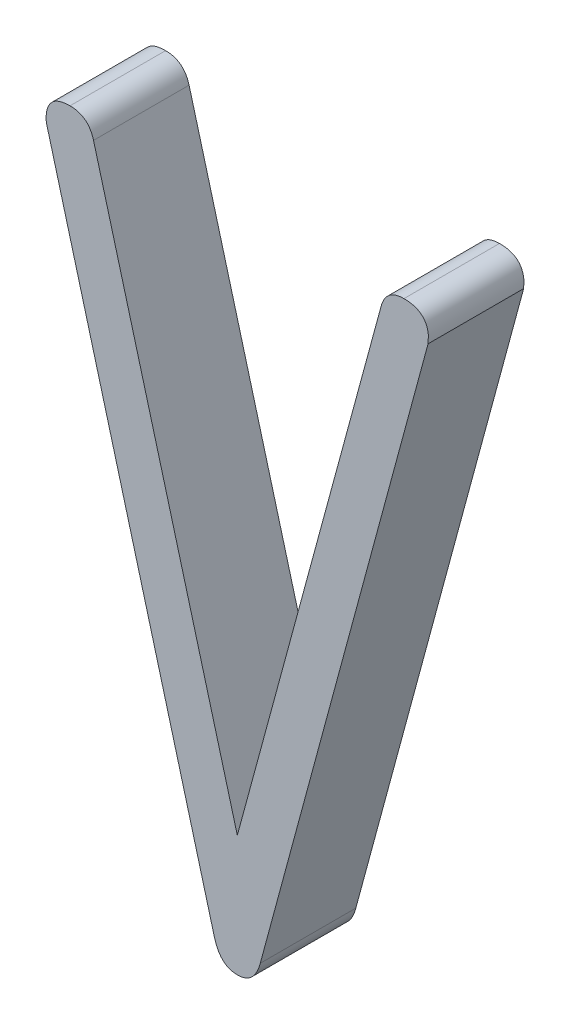
ISO-10303-21;
HEADER;
FILE_DESCRIPTION(('STEP AP214'),'2;1');
FILE_NAME('part.step','',(''),(''),'','','');
FILE_SCHEMA(('AUTOMOTIVE_DESIGN { 1 0 10303 214 1 1 1 1 }'));
ENDSEC;
DATA;
#1=APPLICATION_CONTEXT('core data for automotive mechanical design processes');
#2=APPLICATION_PROTOCOL_DEFINITION('international standard','automotive_design',2000,#1);
#3=PRODUCT_CONTEXT('',#1,'mechanical');
#4=PRODUCT('Part','Part','',(#3));
#5=PRODUCT_RELATED_PRODUCT_CATEGORY('part','',(#4));
#6=PRODUCT_DEFINITION_FORMATION('','',#4);
#7=PRODUCT_DEFINITION_CONTEXT('part definition',#1,'design');
#8=PRODUCT_DEFINITION('design','',#6,#7);
#9=PRODUCT_DEFINITION_SHAPE('','',#8);
#10=(LENGTH_UNIT() NAMED_UNIT(*) SI_UNIT(.MILLI.,.METRE.));
#11=(NAMED_UNIT(*) PLANE_ANGLE_UNIT() SI_UNIT($,.RADIAN.));
#12=(NAMED_UNIT(*) SI_UNIT($,.STERADIAN.) SOLID_ANGLE_UNIT());
#13=UNCERTAINTY_MEASURE_WITH_UNIT(LENGTH_MEASURE(1.E-05),#10,'distance_accuracy_value','');
#14=(GEOMETRIC_REPRESENTATION_CONTEXT(3) GLOBAL_UNCERTAINTY_ASSIGNED_CONTEXT((#13)) GLOBAL_UNIT_ASSIGNED_CONTEXT((#10,
#11,#12)) REPRESENTATION_CONTEXT('',''));
#15=CARTESIAN_POINT('',(0.,0.,0.));
#16=DIRECTION('',(0.,0.,1.));
#17=DIRECTION('',(1.,0.,0.));
#18=AXIS2_PLACEMENT_3D('',#15,#16,#17);
#19=CARTESIAN_POINT('',(0.,0.,0.));
#20=DIRECTION('',(0.,0.,1.));
#21=DIRECTION('',(1.,0.,0.));
#22=AXIS2_PLACEMENT_3D('',#19,#20,#21);
#23=PLANE('',#22);
#24=CARTESIAN_POINT('',(21.1206983712734,-3.7994522451301,0.));
#25=CARTESIAN_POINT('',(21.1185903138631,-3.79946194860089,0.));
#26=CARTESIAN_POINT('',(21.1164462873675,-3.79958557622458,0.));
#27=CARTESIAN_POINT('',(21.1121775705739,-3.80023827212831,0.));
#28=CARTESIAN_POINT('',(21.1100543955455,-3.80077638223874,0.));
#29=CARTESIAN_POINT('',(21.1061037758556,-3.80241864145331,0.));
#30=CARTESIAN_POINT('',(21.1042680794965,-3.803500139914,0.));
#31=CARTESIAN_POINT('',(21.1010989843482,-3.80626212531699,0.));
#32=CARTESIAN_POINT('',(21.0997675696505,-3.80794492867529,0.));
#33=CARTESIAN_POINT('',(21.0975044837042,-3.8120337579714,0.));
#34=CARTESIAN_POINT('',(21.0967231988323,-3.81451747322345,0.));
#35=CARTESIAN_POINT('',(21.0959264060027,-3.81882981526732,0.));
#36=CARTESIAN_POINT('',(21.095754409403,-3.82063923663918,0.));
#37=CARTESIAN_POINT('',(21.0956697633971,-3.82333918361365,0.));
#38=CARTESIAN_POINT('',(21.0956695533646,-3.82422738516833,0.));
#39=CARTESIAN_POINT('',(21.0956771840093,-3.82600262088804,0.));
#40=CARTESIAN_POINT('',(21.0956850137788,-3.82688965500423,0.));
#41=CARTESIAN_POINT('',(21.0956733712734,-3.8277759951301,0.));
#42=B_SPLINE_CURVE_WITH_KNOTS('',3,(#24,#25,#26,#27,#28,#29,#30,#31,#32,#33,#34,#35,#36,#37,#38,
#39,#40,#41),.UNSPECIFIED.,.F.,.F.,(4,2,2,2,2,2,2,2,4),(0.,0.00637906803394492,
0.0129013779902471,0.01917192918956,0.0254669016725837,0.0331339736282286,0.0385746638490084,
0.041238663694575,0.0438990540692007),.UNSPECIFIED.);
#43=CARTESIAN_POINT('',(21.1206983712734,-3.7994522451301,0.));
#44=VERTEX_POINT('',#43);
#45=CARTESIAN_POINT('',(21.0961721212734,-3.8277759951301,0.));
#46=VERTEX_POINT('',#45);
#47=EDGE_CURVE('E148',#44,#46,#42,.T.);
#48=ORIENTED_EDGE('',*,*,#47,.T.);
#49=DIRECTION('',(0.261841637735637,-0.96511085205168,0.));
#50=VECTOR('',#49,1.);
#51=CARTESIAN_POINT('',(21.0966708712734,-3.8315997451301,0.));
#52=LINE('',#51,#50);
#53=CARTESIAN_POINT('',(21.2717583712734,-4.4769472451301,0.));
#54=VERTEX_POINT('',#53);
#55=EDGE_CURVE('E97',#54,#46,#52,.F.);
#56=ORIENTED_EDGE('',*,*,#55,.F.);
#57=CARTESIAN_POINT('',(21.2717583712734,-4.4769472451301,0.));
#58=CARTESIAN_POINT('',(21.2728127435023,-4.48101979600794,0.));
#59=CARTESIAN_POINT('',(21.2744239974176,-4.48531183747608,0.));
#60=CARTESIAN_POINT('',(21.2781859148117,-4.49115196557534,0.));
#61=CARTESIAN_POINT('',(21.2798121972382,-4.49308902499719,0.));
#62=CARTESIAN_POINT('',(21.282708181856,-4.49549217070897,0.));
#63=CARTESIAN_POINT('',(21.2837556944478,-4.49621168334934,0.));
#64=CARTESIAN_POINT('',(21.285973462753,-4.4974384213446,0.));
#65=CARTESIAN_POINT('',(21.2871442355813,-4.4979447038555,0.));
#66=CARTESIAN_POINT('',(21.2895464952244,-4.4987289045473,0.));
#67=CARTESIAN_POINT('',(21.2907773577761,-4.49900879128011,0.));
#68=CARTESIAN_POINT('',(21.2932635049179,-4.49937118105636,0.));
#69=CARTESIAN_POINT('',(21.2945186710394,-4.49945447533704,0.));
#70=CARTESIAN_POINT('',(21.2957683712734,-4.4994522451301,0.));
#71=B_SPLINE_CURVE_WITH_KNOTS('',3,(#57,#58,#59,#60,#61,#62,#63,#64,#65,#66,#67,#68,#69,#70),
.UNSPECIFIED.,.F.,.F.,(4,2,2,2,2,2,4),(0.,0.0130937867306535,0.020594647858926,
0.0243812846568384,0.0281844934508452,0.0319542660278836,0.0357088401121007),.UNSPECIFIED.);
#72=CARTESIAN_POINT('',(21.2957683712734,-4.4994522451301,0.));
#73=VERTEX_POINT('',#72);
#74=EDGE_CURVE('E133',#54,#73,#71,.T.);
#75=ORIENTED_EDGE('',*,*,#74,.T.);
#76=CARTESIAN_POINT('',(21.2957683712734,-4.4994522451301,0.));
#77=CARTESIAN_POINT('',(21.2970420496136,-4.49945113890577,0.));
#78=CARTESIAN_POINT('',(21.2983199628194,-4.49936658822377,0.));
#79=CARTESIAN_POINT('',(21.3008487514697,-4.49899448172415,0.));
#80=CARTESIAN_POINT('',(21.3020995324221,-4.49870630671857,0.));
#81=CARTESIAN_POINT('',(21.3057512224966,-4.49748058853136,0.));
#82=CARTESIAN_POINT('',(21.3080452726058,-4.49618152429531,0.));
#83=CARTESIAN_POINT('',(21.3117377490816,-4.49305922230645,0.));
#84=CARTESIAN_POINT('',(21.31321101156,-4.49131855942591,0.));
#85=CARTESIAN_POINT('',(21.3167214670543,-4.48605988989829,0.));
#86=CARTESIAN_POINT('',(21.3182696065067,-4.48223252293233,0.));
#87=CARTESIAN_POINT('',(21.3195424490052,-4.47787486022175,0.));
#88=CARTESIAN_POINT('',(21.3196718068821,-4.47741121097638,0.));
#89=CARTESIAN_POINT('',(21.3197958712734,-4.4769472451301,0.));
#90=B_SPLINE_CURVE_WITH_KNOTS('',3,(#76,#77,#78,#79,#80,#81,#82,#83,#84,#85,#86,#87,#88,#89),
.UNSPECIFIED.,.F.,.F.,(4,2,2,2,2,2,4),(0.,0.00382370389001308,0.00765908535029806,
0.0153473873779117,0.0221042106874628,0.0342563446680747,0.0356999344152546),.UNSPECIFIED.);
#91=CARTESIAN_POINT('',(21.3197958712734,-4.4769472451301,0.));
#92=VERTEX_POINT('',#91);
#93=EDGE_CURVE('E24',#73,#92,#90,.T.);
#94=ORIENTED_EDGE('',*,*,#93,.T.);
#95=DIRECTION('',(0.261841637735637,0.96511085205168,0.));
#96=VECTOR('',#95,1.);
#97=CARTESIAN_POINT('',(21.3197958712734,-4.4769472451301,0.));
#98=LINE('',#97,#96);
#99=CARTESIAN_POINT('',(21.4953908712734,-3.8277759951301,0.));
#100=VERTEX_POINT('',#99);
#101=EDGE_CURVE('E165',#100,#92,#98,.F.);
#102=ORIENTED_EDGE('',*,*,#101,.F.);
#103=CARTESIAN_POINT('',(21.4958983712734,-3.8277759951301,0.));
#104=CARTESIAN_POINT('',(21.495887294004,-3.82677034094273,0.));
#105=CARTESIAN_POINT('',(21.495897423019,-3.82576388392917,0.));
#106=CARTESIAN_POINT('',(21.4958993231905,-3.82374724968531,0.));
#107=CARTESIAN_POINT('',(21.4958910232864,-3.82273707310141,0.));
#108=CARTESIAN_POINT('',(21.4957440683493,-3.81966605674523,0.));
#109=CARTESIAN_POINT('',(21.495478478193,-3.81760833005813,0.));
#110=CARTESIAN_POINT('',(21.4944487841622,-3.81340572762339,0.));
#111=CARTESIAN_POINT('',(21.4936422947943,-3.81126947018837,0.));
#112=CARTESIAN_POINT('',(21.4912919883958,-3.80739524900692,0.));
#113=CARTESIAN_POINT('',(21.489742637222,-3.80566042204234,0.));
#114=CARTESIAN_POINT('',(21.4863237266705,-3.80305342310958,0.));
#115=CARTESIAN_POINT('',(21.4845073762357,-3.80210790809743,0.));
#116=CARTESIAN_POINT('',(21.479443121936,-3.80021155263044,0.));
#117=CARTESIAN_POINT('',(21.4760519252917,-3.79968220013427,0.));
#118=CARTESIAN_POINT('',(21.4718263193732,-3.79947267071844,0.));
#119=CARTESIAN_POINT('',(21.4709800901237,-3.79945341193951,0.));
#120=CARTESIAN_POINT('',(21.4701383712734,-3.7994522451301,0.));
#121=B_SPLINE_CURVE_WITH_KNOTS('',3,(#103,#104,#105,#106,#107,#108,#109,#110,#111,#112,#113,
#114,#115,#116,#117,#118,#119,#120),.UNSPECIFIED.,.F.,.F.,(4,2,2,2,2,2,2,2,4),(0.,
0.00301848469965674,0.00604862868268714,0.012239313799241,0.0189826372191355,0.0257769963324192,
0.0318318197587784,0.0419463219560085,0.0444820605668184),.UNSPECIFIED.);
#122=CARTESIAN_POINT('',(21.4701383712734,-3.7994522451301,0.));
#123=VERTEX_POINT('',#122);
#124=EDGE_CURVE('E113',#100,#123,#121,.T.);
#125=ORIENTED_EDGE('',*,*,#124,.T.);
#126=CARTESIAN_POINT('',(21.4701383712734,-3.7994522451301,0.));
#127=CARTESIAN_POINT('',(21.4684627986756,-3.7994538497395,0.));
#128=CARTESIAN_POINT('',(21.4667737151767,-3.79956645553327,0.));
#129=CARTESIAN_POINT('',(21.4634288895068,-3.80009380005809,0.));
#130=CARTESIAN_POINT('',(21.4617736458116,-3.80051153165073,0.));
#131=CARTESIAN_POINT('',(21.4580414339516,-3.80194419133063,0.));
#132=CARTESIAN_POINT('',(21.4560174515428,-3.80311605552713,0.));
#133=CARTESIAN_POINT('',(21.4525179199704,-3.8060737486895,0.));
#134=CARTESIAN_POINT('',(21.4510421037115,-3.80785927782682,0.));
#135=CARTESIAN_POINT('',(21.4481656561408,-3.81247955525888,0.));
#136=CARTESIAN_POINT('',(21.4469830479753,-3.81546068200283,0.));
#137=CARTESIAN_POINT('',(21.4462333712734,-3.8184222451301,0.));
#138=B_SPLINE_CURVE_WITH_KNOTS('',3,(#126,#127,#128,#129,#130,#131,#132,#133,#134,#135,#136,
#137),.UNSPECIFIED.,.F.,.F.,(4,2,2,2,2,4),(0.,0.00504287618513018,0.0101358917776409,
0.0169963092321349,0.0238533795314925,0.0331771308776703),.UNSPECIFIED.);
#139=CARTESIAN_POINT('',(21.4462333712734,-3.8184222451301,0.));
#140=VERTEX_POINT('',#139);
#141=EDGE_CURVE('E163',#123,#140,#138,.T.);
#142=ORIENTED_EDGE('',*,*,#141,.T.);
#143=DIRECTION('',(-0.261820959999834,-0.965116461834926,0.));
#144=VECTOR('',#143,1.);
#145=CARTESIAN_POINT('',(21.4462333712734,-3.8184222451301,0.));
#146=LINE('',#145,#144);
#147=CARTESIAN_POINT('',(21.2957858712734,-4.3729972451301,0.));
#148=VERTEX_POINT('',#147);
#149=EDGE_CURVE('E160',#148,#140,#146,.F.);
#150=ORIENTED_EDGE('',*,*,#149,.F.);
#151=DIRECTION('',(-0.261857023404154,0.965106677675539,0.));
#152=VECTOR('',#151,1.);
#153=CARTESIAN_POINT('',(21.2957858712734,-4.3729972451301,0.));
#154=LINE('',#153,#152);
#155=CARTESIAN_POINT('',(21.1453208712734,-3.8184397451301,0.));
#156=VERTEX_POINT('',#155);
#157=EDGE_CURVE('E155',#156,#148,#154,.F.);
#158=ORIENTED_EDGE('',*,*,#157,.F.);
#159=CARTESIAN_POINT('',(21.1453208712734,-3.8184397451301,0.));
#160=CARTESIAN_POINT('',(21.1448637011588,-3.81679123952632,0.));
#161=CARTESIAN_POINT('',(21.1443054028683,-3.81515804950251,0.));
#162=CARTESIAN_POINT('',(21.142919028467,-3.81198685998502,0.));
#163=CARTESIAN_POINT('',(21.142087407768,-3.81045044558485,0.));
#164=CARTESIAN_POINT('',(21.1397296731456,-3.80705983710951,0.));
#165=CARTESIAN_POINT('',(21.1380606148472,-3.80529669132993,0.));
#166=CARTESIAN_POINT('',(21.1342035519836,-3.80247536987807,0.));
#167=CARTESIAN_POINT('',(21.1320148392476,-3.80141816380302,0.));
#168=CARTESIAN_POINT('',(21.1282650120564,-3.80025007155288,0.));
#169=CARTESIAN_POINT('',(21.1267576592499,-3.79993632366032,0.));
#170=CARTESIAN_POINT('',(21.1237306685363,-3.79954004034406,0.));
#171=CARTESIAN_POINT('',(21.1222114258839,-3.79945463632598,0.));
#172=CARTESIAN_POINT('',(21.1206983712734,-3.7994522451301,0.));
#173=B_SPLINE_CURVE_WITH_KNOTS('',3,(#159,#160,#161,#162,#163,#164,#165,#166,#167,#168,#169,
#170,#171,#172),.UNSPECIFIED.,.F.,.F.,(4,2,2,2,2,2,4),(0.,0.00514690530811912,
0.0103633814879559,0.017499032110854,0.0246444633897961,0.029247673133714,0.0337927767257358),.UNSPECIFIED.);
#174=EDGE_CURVE('E149',#156,#44,#173,.T.);
#175=ORIENTED_EDGE('',*,*,#174,.T.);
#176=EDGE_LOOP('',(#48,#56,#75,#94,#102,#125,#142,#150,#158,#175));
#177=FACE_BOUND('',#176,.T.);
#178=ADVANCED_FACE('F17',(#177),#23,.T.);
#179=CARTESIAN_POINT('',(21.2957683712734,-4.4994522451301,-0.1));
#180=CARTESIAN_POINT('',(21.3137933712734,-4.4994522451301,-0.1));
#181=CARTESIAN_POINT('',(21.3197958712734,-4.4769472451301,-0.1));
#182=CARTESIAN_POINT('',(21.2957683712734,-4.4994522451301,0.));
#183=CARTESIAN_POINT('',(21.3137933712734,-4.4994522451301,0.));
#184=CARTESIAN_POINT('',(21.3197958712734,-4.4769472451301,0.));
#185=B_SPLINE_SURFACE_WITH_KNOTS('',1,2,((#179,#180,#181),(#182,#183,#184)),.UNSPECIFIED.,.F.,
.F.,.F.,(2,2),(3,3),(0.,1.),(0.,1.),.UNSPECIFIED.);
#186=DIRECTION('',(0.,0.,-1.));
#187=VECTOR('',#186,1.);
#188=CARTESIAN_POINT('',(21.2957683712734,-4.4994522451301,-0.05));
#189=LINE('',#188,#187);
#190=CARTESIAN_POINT('',(21.2957683712734,-4.4994522451301,-0.1));
#191=VERTEX_POINT('',#190);
#192=EDGE_CURVE('E141',#73,#191,#189,.T.);
#193=CARTESIAN_POINT('',(21.2957683712734,-4.4994522451301,-0.1));
#194=CARTESIAN_POINT('',(21.2970420496136,-4.49945113890577,-0.1));
#195=CARTESIAN_POINT('',(21.2983199628194,-4.49936658822377,-0.1));
#196=CARTESIAN_POINT('',(21.3008487514697,-4.49899448172415,-0.1));
#197=CARTESIAN_POINT('',(21.3020995324221,-4.49870630671857,-0.1));
#198=CARTESIAN_POINT('',(21.3057512224966,-4.49748058853136,-0.1));
#199=CARTESIAN_POINT('',(21.3080452726058,-4.49618152429531,-0.1));
#200=CARTESIAN_POINT('',(21.3117377490816,-4.49305922230645,-0.1));
#201=CARTESIAN_POINT('',(21.31321101156,-4.49131855942591,-0.1));
#202=CARTESIAN_POINT('',(21.3167214670543,-4.48605988989829,-0.1));
#203=CARTESIAN_POINT('',(21.3182696065067,-4.48223252293233,-0.1));
#204=CARTESIAN_POINT('',(21.3195424490052,-4.47787486022175,-0.1));
#205=CARTESIAN_POINT('',(21.3196718068821,-4.47741121097638,-0.1));
#206=CARTESIAN_POINT('',(21.3197958712734,-4.4769472451301,-0.1));
#207=B_SPLINE_CURVE_WITH_KNOTS('',3,(#193,#194,#195,#196,#197,#198,#199,#200,#201,#202,#203,
#204,#205,#206),.UNSPECIFIED.,.F.,.F.,(4,2,2,2,2,2,4),(0.,0.00382370389001308,
0.00765908535029806,0.0153473873779117,0.0221042106874628,0.0342563446680747,
0.0356999344152546),.UNSPECIFIED.);
#208=CARTESIAN_POINT('',(21.3197958712734,-4.4769472451301,-0.1));
#209=VERTEX_POINT('',#208);
#210=EDGE_CURVE('E131',#191,#209,#207,.T.);
#211=DIRECTION('',(0.,0.,1.));
#212=VECTOR('',#211,1.);
#213=CARTESIAN_POINT('',(21.3197958712734,-4.4769472451301,-0.1));
#214=LINE('',#213,#212);
#215=EDGE_CURVE('E117',#92,#209,#214,.F.);
#216=ORIENTED_EDGE('',*,*,#192,.T.);
#217=ORIENTED_EDGE('',*,*,#210,.T.);
#218=ORIENTED_EDGE('',*,*,#215,.F.);
#219=ORIENTED_EDGE('',*,*,#93,.F.);
#220=EDGE_LOOP('',(#216,#217,#218,#219));
#221=FACE_BOUND('',#220,.T.);
#222=ADVANCED_FACE('F251',(#221),#185,.F.);
#223=CARTESIAN_POINT('',(21.3197958712734,-4.4769472451301,-0.1));
#224=DIRECTION('',(0.96511085205168,-0.261841637735637,0.));
#225=DIRECTION('',(0.261841637735637,0.96511085205168,0.));
#226=AXIS2_PLACEMENT_3D('',#223,#224,#225);
#227=PLANE('',#226);
#228=DIRECTION('',(0.261841637735637,0.96511085205168,0.));
#229=VECTOR('',#228,1.);
#230=CARTESIAN_POINT('',(21.3197958712734,-4.4769472451301,-0.1));
#231=LINE('',#230,#229);
#232=CARTESIAN_POINT('',(21.4953908712734,-3.8277759951301,-0.1));
#233=VERTEX_POINT('',#232);
#234=EDGE_CURVE('E124',#209,#233,#231,.T.);
#235=ORIENTED_EDGE('',*,*,#234,.T.);
#236=DIRECTION('',(0.,0.,1.));
#237=VECTOR('',#236,1.);
#238=CARTESIAN_POINT('',(21.4958983712734,-3.82785860020256,-0.1));
#239=LINE('',#238,#237);
#240=EDGE_CURVE('E108',#233,#100,#239,.T.);
#241=ORIENTED_EDGE('',*,*,#240,.T.);
#242=ORIENTED_EDGE('',*,*,#101,.T.);
#243=ORIENTED_EDGE('',*,*,#215,.T.);
#244=EDGE_LOOP('',(#235,#241,#242,#243));
#245=FACE_BOUND('',#244,.T.);
#246=ADVANCED_FACE('F130',(#245),#227,.T.);
#247=CARTESIAN_POINT('',(21.4958983712734,-3.8280929376301,-0.1));
#248=CARTESIAN_POINT('',(21.4958983712734,-3.8260225913801,-0.1));
#249=CARTESIAN_POINT('',(21.4958983712734,-3.8239522451301,-0.1));
#250=CARTESIAN_POINT('',(21.4958983712734,-3.7994522451301,-0.1));
#251=CARTESIAN_POINT('',(21.4701383712734,-3.7994522451301,-0.1));
#252=CARTESIAN_POINT('',(21.4958983712734,-3.8280929376301,0.));
#253=CARTESIAN_POINT('',(21.4958983712734,-3.8260225913801,0.));
#254=CARTESIAN_POINT('',(21.4958983712734,-3.8239522451301,0.));
#255=CARTESIAN_POINT('',(21.4958983712734,-3.7994522451301,0.));
#256=CARTESIAN_POINT('',(21.4701383712734,-3.7994522451301,0.));
#257=B_SPLINE_SURFACE_WITH_KNOTS('',1,2,((#247,#248,#249,#250,#251),(#252,#253,#254,#255,#256)),
.UNSPECIFIED.,.F.,.F.,.F.,(2,2),(3,2,3),(0.,1.),(-0.0845039285713991,0.,1.),.UNSPECIFIED.);
#258=CARTESIAN_POINT('',(21.4958983712734,-3.8277759951301,-0.1));
#259=CARTESIAN_POINT('',(21.495887294004,-3.82677034094272,-0.1));
#260=CARTESIAN_POINT('',(21.495897423019,-3.82576388392917,-0.1));
#261=CARTESIAN_POINT('',(21.4958993231905,-3.8237472496853,-0.1));
#262=CARTESIAN_POINT('',(21.4958910232864,-3.82273707310141,-0.1));
#263=CARTESIAN_POINT('',(21.4957440683493,-3.81966605674522,-0.1));
#264=CARTESIAN_POINT('',(21.495478478193,-3.81760833005813,-0.1));
#265=CARTESIAN_POINT('',(21.4944487841622,-3.81340572762338,-0.1));
#266=CARTESIAN_POINT('',(21.4936422947943,-3.81126947018837,-0.1));
#267=CARTESIAN_POINT('',(21.4912919883958,-3.80739524900692,-0.1));
#268=CARTESIAN_POINT('',(21.489742637222,-3.80566042204234,-0.1));
#269=CARTESIAN_POINT('',(21.4863237266705,-3.80305342310958,-0.1));
#270=CARTESIAN_POINT('',(21.4845073762357,-3.80210790809743,-0.1));
#271=CARTESIAN_POINT('',(21.479443121936,-3.80021155263044,-0.1));
#272=CARTESIAN_POINT('',(21.4760519252917,-3.79968220013427,-0.1));
#273=CARTESIAN_POINT('',(21.4718263193732,-3.79947267071844,-0.1));
#274=CARTESIAN_POINT('',(21.4709800901237,-3.79945341193951,-0.1));
#275=CARTESIAN_POINT('',(21.4701383712734,-3.7994522451301,-0.1));
#276=B_SPLINE_CURVE_WITH_KNOTS('',3,(#258,#259,#260,#261,#262,#263,#264,#265,#266,#267,#268,
#269,#270,#271,#272,#273,#274,#275),.UNSPECIFIED.,.F.,.F.,(4,2,2,2,2,2,2,2,4),(0.,
0.00301848469965761,0.00604862868268851,0.0122393137992445,0.0189826372191374,
0.0257769963324202,0.0318318197587756,0.0419463219560158,0.0444820605668152),.UNSPECIFIED.);
#277=CARTESIAN_POINT('',(21.4701383712734,-3.7994522451301,-0.1));
#278=VERTEX_POINT('',#277);
#279=EDGE_CURVE('E112',#233,#278,#276,.T.);
#280=DIRECTION('',(0.,0.,1.));
#281=VECTOR('',#280,1.);
#282=CARTESIAN_POINT('',(21.4701383712734,-3.7994522451301,-0.05));
#283=LINE('',#282,#281);
#284=EDGE_CURVE('E161',#278,#123,#283,.T.);
#285=ORIENTED_EDGE('',*,*,#240,.F.);
#286=ORIENTED_EDGE('',*,*,#279,.T.);
#287=ORIENTED_EDGE('',*,*,#284,.T.);
#288=ORIENTED_EDGE('',*,*,#124,.F.);
#289=EDGE_LOOP('',(#285,#286,#287,#288));
#290=FACE_BOUND('',#289,.T.);
#291=ADVANCED_FACE('F110',(#290),#257,.F.);
#292=CARTESIAN_POINT('',(21.4701383712734,-3.7994522451301,-0.1));
#293=CARTESIAN_POINT('',(21.4513258712734,-3.7994522451301,-0.1));
#294=CARTESIAN_POINT('',(21.4462333712734,-3.8184222451301,-0.1));
#295=CARTESIAN_POINT('',(21.4701383712734,-3.7994522451301,0.));
#296=CARTESIAN_POINT('',(21.4513258712734,-3.7994522451301,0.));
#297=CARTESIAN_POINT('',(21.4462333712734,-3.8184222451301,0.));
#298=B_SPLINE_SURFACE_WITH_KNOTS('',1,2,((#292,#293,#294),(#295,#296,#297)),.UNSPECIFIED.,.F.,
.F.,.F.,(2,2),(3,3),(0.,1.),(0.,1.),.UNSPECIFIED.);
#299=CARTESIAN_POINT('',(21.4701383712734,-3.7994522451301,-0.1));
#300=CARTESIAN_POINT('',(21.4684627986756,-3.7994538497395,-0.1));
#301=CARTESIAN_POINT('',(21.4667737151767,-3.79956645553328,-0.1));
#302=CARTESIAN_POINT('',(21.4634288895068,-3.80009380005809,-0.1));
#303=CARTESIAN_POINT('',(21.4617736458116,-3.80051153165073,-0.1));
#304=CARTESIAN_POINT('',(21.4580414339516,-3.80194419133063,-0.1));
#305=CARTESIAN_POINT('',(21.4560174515428,-3.80311605552713,-0.1));
#306=CARTESIAN_POINT('',(21.4525179199704,-3.8060737486895,-0.1));
#307=CARTESIAN_POINT('',(21.4510421037115,-3.80785927782682,-0.1));
#308=CARTESIAN_POINT('',(21.4481656561408,-3.81247955525888,-0.1));
#309=CARTESIAN_POINT('',(21.4469830479753,-3.81546068200283,-0.1));
#310=CARTESIAN_POINT('',(21.4462333712734,-3.8184222451301,-0.1));
#311=B_SPLINE_CURVE_WITH_KNOTS('',3,(#299,#300,#301,#302,#303,#304,#305,#306,#307,#308,#309,
#310),.UNSPECIFIED.,.F.,.F.,(4,2,2,2,2,4),(0.,0.00504287618513024,0.0101358917776407,
0.0169963092321348,0.0238533795314923,0.0331771308776701),.UNSPECIFIED.);
#312=CARTESIAN_POINT('',(21.4462333712734,-3.8184222451301,-0.1));
#313=VERTEX_POINT('',#312);
#314=EDGE_CURVE('E128',#278,#313,#311,.T.);
#315=DIRECTION('',(0.,0.,1.));
#316=VECTOR('',#315,1.);
#317=CARTESIAN_POINT('',(21.4462333712734,-3.8184222451301,-0.1));
#318=LINE('',#317,#316);
#319=EDGE_CURVE('E158',#140,#313,#318,.F.);
#320=ORIENTED_EDGE('',*,*,#284,.F.);
#321=ORIENTED_EDGE('',*,*,#314,.T.);
#322=ORIENTED_EDGE('',*,*,#319,.F.);
#323=ORIENTED_EDGE('',*,*,#141,.F.);
#324=EDGE_LOOP('',(#320,#321,#322,#323));
#325=FACE_BOUND('',#324,.T.);
#326=ADVANCED_FACE('F216',(#325),#298,.F.);
#327=CARTESIAN_POINT('',(21.4462333712734,-3.8184222451301,-0.1));
#328=DIRECTION('',(-0.965116461834926,0.261820959999834,0.));
#329=DIRECTION('',(-0.261820959999834,-0.965116461834926,0.));
#330=AXIS2_PLACEMENT_3D('',#327,#328,#329);
#331=PLANE('',#330);
#332=DIRECTION('',(-0.261820959999839,-0.965116461834924,0.));
#333=VECTOR('',#332,1.);
#334=CARTESIAN_POINT('',(21.4462333712734,-3.8184222451301,-0.1));
#335=LINE('',#334,#333);
#336=CARTESIAN_POINT('',(21.2957858712734,-4.3729972451301,-0.1));
#337=VERTEX_POINT('',#336);
#338=EDGE_CURVE('E215',#313,#337,#335,.T.);
#339=ORIENTED_EDGE('',*,*,#338,.T.);
#340=DIRECTION('',(0.,0.,1.));
#341=VECTOR('',#340,1.);
#342=CARTESIAN_POINT('',(21.2957858712734,-4.3729972451301,-0.1));
#343=LINE('',#342,#341);
#344=EDGE_CURVE('E153',#148,#337,#343,.F.);
#345=ORIENTED_EDGE('',*,*,#344,.F.);
#346=ORIENTED_EDGE('',*,*,#149,.T.);
#347=ORIENTED_EDGE('',*,*,#319,.T.);
#348=EDGE_LOOP('',(#339,#345,#346,#347));
#349=FACE_BOUND('',#348,.T.);
#350=ADVANCED_FACE('F221',(#349),#331,.T.);
#351=CARTESIAN_POINT('',(21.2957858712734,-4.3729972451301,-0.1));
#352=DIRECTION('',(0.965106677675539,0.261857023404154,0.));
#353=DIRECTION('',(-0.261857023404154,0.965106677675539,0.));
#354=AXIS2_PLACEMENT_3D('',#351,#352,#353);
#355=PLANE('',#354);
#356=DIRECTION('',(-0.261857023404153,0.965106677675539,0.));
#357=VECTOR('',#356,1.);
#358=CARTESIAN_POINT('',(21.2957858712734,-4.3729972451301,-0.1));
#359=LINE('',#358,#357);
#360=CARTESIAN_POINT('',(21.1453208712734,-3.8184397451301,-0.1));
#361=VERTEX_POINT('',#360);
#362=EDGE_CURVE('E307',#337,#361,#359,.T.);
#363=ORIENTED_EDGE('',*,*,#362,.T.);
#364=DIRECTION('',(0.,0.,1.));
#365=VECTOR('',#364,1.);
#366=CARTESIAN_POINT('',(21.1453208712734,-3.8184397451301,-0.05));
#367=LINE('',#366,#365);
#368=EDGE_CURVE('E150',#361,#156,#367,.T.);
#369=ORIENTED_EDGE('',*,*,#368,.T.);
#370=ORIENTED_EDGE('',*,*,#157,.T.);
#371=ORIENTED_EDGE('',*,*,#344,.T.);
#372=EDGE_LOOP('',(#363,#369,#370,#371));
#373=FACE_BOUND('',#372,.T.);
#374=ADVANCED_FACE('F295',(#373),#355,.T.);
#375=CARTESIAN_POINT('',(21.1453208712734,-3.8184397451301,-0.1));
#376=CARTESIAN_POINT('',(21.1400883712734,-3.7994522451301,-0.1));
#377=CARTESIAN_POINT('',(21.1206983712734,-3.7994522451301,-0.1));
#378=CARTESIAN_POINT('',(21.1453208712734,-3.8184397451301,0.));
#379=CARTESIAN_POINT('',(21.1400883712734,-3.7994522451301,0.));
#380=CARTESIAN_POINT('',(21.1206983712734,-3.7994522451301,0.));
#381=B_SPLINE_SURFACE_WITH_KNOTS('',1,2,((#375,#376,#377),(#378,#379,#380)),.UNSPECIFIED.,.F.,
.F.,.F.,(2,2),(3,3),(0.,1.),(0.,1.),.UNSPECIFIED.);
#382=CARTESIAN_POINT('',(21.1453208712734,-3.8184397451301,-0.1));
#383=CARTESIAN_POINT('',(21.1448637011588,-3.81679123952632,-0.1));
#384=CARTESIAN_POINT('',(21.1443054028683,-3.81515804950252,-0.1));
#385=CARTESIAN_POINT('',(21.142919028467,-3.81198685998502,-0.1));
#386=CARTESIAN_POINT('',(21.142087407768,-3.81045044558485,-0.1));
#387=CARTESIAN_POINT('',(21.1397296731456,-3.80705983710951,-0.1));
#388=CARTESIAN_POINT('',(21.1380606148472,-3.80529669132993,-0.1));
#389=CARTESIAN_POINT('',(21.1342035519836,-3.80247536987807,-0.1));
#390=CARTESIAN_POINT('',(21.1320148392476,-3.80141816380302,-0.1));
#391=CARTESIAN_POINT('',(21.1282650120564,-3.80025007155288,-0.1));
#392=CARTESIAN_POINT('',(21.1267576592499,-3.79993632366032,-0.1));
#393=CARTESIAN_POINT('',(21.1237306685363,-3.79954004034406,-0.1));
#394=CARTESIAN_POINT('',(21.1222114258839,-3.79945463632598,-0.1));
#395=CARTESIAN_POINT('',(21.1206983712734,-3.7994522451301,-0.1));
#396=B_SPLINE_CURVE_WITH_KNOTS('',3,(#382,#383,#384,#385,#386,#387,#388,#389,#390,#391,#392,
#393,#394,#395),.UNSPECIFIED.,.F.,.F.,(4,2,2,2,2,2,4),(0.,0.00514690530811831,
0.0103633814879559,0.0174990321108539,0.024644463389796,0.0292476731337141,0.0337927767257358),.UNSPECIFIED.);
#397=CARTESIAN_POINT('',(21.1206983712734,-3.7994522451301,-0.1));
#398=VERTEX_POINT('',#397);
#399=EDGE_CURVE('E205',#361,#398,#396,.T.);
#400=DIRECTION('',(0.,0.,1.));
#401=VECTOR('',#400,1.);
#402=CARTESIAN_POINT('',(21.1206983712734,-3.7994522451301,-0.05));
#403=LINE('',#402,#401);
#404=EDGE_CURVE('E145',#398,#44,#403,.T.);
#405=ORIENTED_EDGE('',*,*,#368,.F.);
#406=ORIENTED_EDGE('',*,*,#399,.T.);
#407=ORIENTED_EDGE('',*,*,#404,.T.);
#408=ORIENTED_EDGE('',*,*,#174,.F.);
#409=EDGE_LOOP('',(#405,#406,#407,#408));
#410=FACE_BOUND('',#409,.T.);
#411=ADVANCED_FACE('F226',(#410),#381,.F.);
#412=CARTESIAN_POINT('',(21.1206983712734,-3.7994522451301,-0.1));
#413=CARTESIAN_POINT('',(21.0956733712734,-3.7994522451301,-0.1));
#414=CARTESIAN_POINT('',(21.0956733712734,-3.8239522451301,-0.1));
#415=CARTESIAN_POINT('',(21.0956733712734,-3.8260225913801,-0.1));
#416=CARTESIAN_POINT('',(21.0956733712734,-3.8280929376301,-0.1));
#417=CARTESIAN_POINT('',(21.1206983712734,-3.7994522451301,0.));
#418=CARTESIAN_POINT('',(21.0956733712734,-3.7994522451301,0.));
#419=CARTESIAN_POINT('',(21.0956733712734,-3.8239522451301,0.));
#420=CARTESIAN_POINT('',(21.0956733712734,-3.8260225913801,0.));
#421=CARTESIAN_POINT('',(21.0956733712734,-3.8280929376301,0.));
#422=B_SPLINE_SURFACE_WITH_KNOTS('',1,2,((#412,#413,#414,#415,#416),(#417,#418,#419,#420,#421)),
.UNSPECIFIED.,.F.,.F.,.F.,(2,2),(3,2,3),(0.,1.),(0.,1.,1.0845039285714),.UNSPECIFIED.);
#423=CARTESIAN_POINT('',(21.1206983712734,-3.7994522451301,-0.1));
#424=CARTESIAN_POINT('',(21.1185903138631,-3.79946194860089,-0.1));
#425=CARTESIAN_POINT('',(21.1164462873675,-3.79958557622458,-0.1));
#426=CARTESIAN_POINT('',(21.1121775705739,-3.80023827212831,-0.1));
#427=CARTESIAN_POINT('',(21.1100543955455,-3.80077638223874,-0.1));
#428=CARTESIAN_POINT('',(21.1061037758556,-3.80241864145331,-0.1));
#429=CARTESIAN_POINT('',(21.1042680794965,-3.803500139914,-0.1));
#430=CARTESIAN_POINT('',(21.1010989843482,-3.80626212531699,-0.1));
#431=CARTESIAN_POINT('',(21.0997675696505,-3.80794492867529,-0.1));
#432=CARTESIAN_POINT('',(21.0975044837042,-3.8120337579714,-0.1));
#433=CARTESIAN_POINT('',(21.0967231988323,-3.81451747322345,-0.1));
#434=CARTESIAN_POINT('',(21.0959264060027,-3.81882981526732,-0.1));
#435=CARTESIAN_POINT('',(21.095754409403,-3.82063923663918,-0.1));
#436=CARTESIAN_POINT('',(21.0956697633971,-3.82333918361365,-0.1));
#437=CARTESIAN_POINT('',(21.0956695533646,-3.82422738516833,-0.1));
#438=CARTESIAN_POINT('',(21.0956771840093,-3.82600262088804,-0.1));
#439=CARTESIAN_POINT('',(21.0956850137788,-3.82688965500423,-0.1));
#440=CARTESIAN_POINT('',(21.0956733712734,-3.8277759951301,-0.1));
#441=B_SPLINE_CURVE_WITH_KNOTS('',3,(#423,#424,#425,#426,#427,#428,#429,#430,#431,#432,#433,
#434,#435,#436,#437,#438,#439,#440),.UNSPECIFIED.,.F.,.F.,(4,2,2,2,2,2,2,2,4),(0.,
0.00637906803394492,0.0129013779902471,0.01917192918956,0.0254669016725837,0.0331339736282286,
0.0385746638490083,0.0412386636945749,0.043899054069201),.UNSPECIFIED.);
#442=CARTESIAN_POINT('',(21.0961721212734,-3.8277759951301,-0.1));
#443=VERTEX_POINT('',#442);
#444=EDGE_CURVE('E182',#398,#443,#441,.T.);
#445=DIRECTION('',(0.,0.,1.));
#446=VECTOR('',#445,1.);
#447=CARTESIAN_POINT('',(21.0956733712734,-3.82792310270132,0.));
#448=LINE('',#447,#446);
#449=EDGE_CURVE('E143',#46,#443,#448,.F.);
#450=ORIENTED_EDGE('',*,*,#404,.F.);
#451=ORIENTED_EDGE('',*,*,#444,.T.);
#452=ORIENTED_EDGE('',*,*,#449,.F.);
#453=ORIENTED_EDGE('',*,*,#47,.F.);
#454=EDGE_LOOP('',(#450,#451,#452,#453));
#455=FACE_BOUND('',#454,.T.);
#456=ADVANCED_FACE('F278',(#455),#422,.F.);
#457=CARTESIAN_POINT('',(21.0966708712734,-3.8315997451301,-0.1));
#458=DIRECTION('',(-0.96511085205168,-0.261841637735637,0.));
#459=DIRECTION('',(0.261841637735637,-0.96511085205168,0.));
#460=AXIS2_PLACEMENT_3D('',#457,#458,#459);
#461=PLANE('',#460);
#462=DIRECTION('',(0.261841637735637,-0.96511085205168,0.));
#463=VECTOR('',#462,1.);
#464=CARTESIAN_POINT('',(21.0966708712734,-3.8315997451301,-0.1));
#465=LINE('',#464,#463);
#466=CARTESIAN_POINT('',(21.2717583712734,-4.4769472451301,-0.1));
#467=VERTEX_POINT('',#466);
#468=EDGE_CURVE('E35',#443,#467,#465,.T.);
#469=ORIENTED_EDGE('',*,*,#468,.T.);
#470=DIRECTION('',(0.,0.,1.));
#471=VECTOR('',#470,1.);
#472=CARTESIAN_POINT('',(21.2717583712734,-4.4769472451301,-0.05));
#473=LINE('',#472,#471);
#474=EDGE_CURVE('E43',#467,#54,#473,.T.);
#475=ORIENTED_EDGE('',*,*,#474,.T.);
#476=ORIENTED_EDGE('',*,*,#55,.T.);
#477=ORIENTED_EDGE('',*,*,#449,.T.);
#478=EDGE_LOOP('',(#469,#475,#476,#477));
#479=FACE_BOUND('',#478,.T.);
#480=ADVANCED_FACE('F187',(#479),#461,.T.);
#481=CARTESIAN_POINT('',(21.2717583712734,-4.4769472451301,-0.1));
#482=CARTESIAN_POINT('',(21.2777608712734,-4.4994522451301,-0.1));
#483=CARTESIAN_POINT('',(21.2957683712734,-4.4994522451301,-0.1));
#484=CARTESIAN_POINT('',(21.2717583712734,-4.4769472451301,0.));
#485=CARTESIAN_POINT('',(21.2777608712734,-4.4994522451301,0.));
#486=CARTESIAN_POINT('',(21.2957683712734,-4.4994522451301,0.));
#487=B_SPLINE_SURFACE_WITH_KNOTS('',1,2,((#481,#482,#483),(#484,#485,#486)),.UNSPECIFIED.,.F.,
.F.,.F.,(2,2),(3,3),(0.,1.),(0.,1.),.UNSPECIFIED.);
#488=CARTESIAN_POINT('',(21.2717583712734,-4.4769472451301,-0.1));
#489=CARTESIAN_POINT('',(21.2728127435023,-4.48101979600794,-0.1));
#490=CARTESIAN_POINT('',(21.2744239974176,-4.48531183747608,-0.1));
#491=CARTESIAN_POINT('',(21.2781859148117,-4.49115196557534,-0.1));
#492=CARTESIAN_POINT('',(21.2798121972382,-4.49308902499719,-0.1));
#493=CARTESIAN_POINT('',(21.282708181856,-4.49549217070897,-0.1));
#494=CARTESIAN_POINT('',(21.2837556944478,-4.49621168334934,-0.1));
#495=CARTESIAN_POINT('',(21.285973462753,-4.4974384213446,-0.1));
#496=CARTESIAN_POINT('',(21.2871442355813,-4.4979447038555,-0.1));
#497=CARTESIAN_POINT('',(21.2895464952244,-4.4987289045473,-0.1));
#498=CARTESIAN_POINT('',(21.2907773577761,-4.49900879128011,-0.1));
#499=CARTESIAN_POINT('',(21.2932635049179,-4.49937118105636,-0.1));
#500=CARTESIAN_POINT('',(21.2945186710394,-4.49945447533703,-0.1));
#501=CARTESIAN_POINT('',(21.2957683712734,-4.4994522451301,-0.1));
#502=B_SPLINE_CURVE_WITH_KNOTS('',3,(#488,#489,#490,#491,#492,#493,#494,#495,#496,#497,#498,
#499,#500,#501),.UNSPECIFIED.,.F.,.F.,(4,2,2,2,2,2,4),(0.,0.0130937867306535,0.020594647858926,
0.0243812846568384,0.0281844934508452,0.0319542660278834,0.0357088401121006),.UNSPECIFIED.);
#503=EDGE_CURVE('E11',#467,#191,#502,.T.);
#504=ORIENTED_EDGE('',*,*,#474,.F.);
#505=ORIENTED_EDGE('',*,*,#503,.T.);
#506=ORIENTED_EDGE('',*,*,#192,.F.);
#507=ORIENTED_EDGE('',*,*,#74,.F.);
#508=EDGE_LOOP('',(#504,#505,#506,#507));
#509=FACE_BOUND('',#508,.T.);
#510=ADVANCED_FACE('F19',(#509),#487,.F.);
#511=CARTESIAN_POINT('',(0.,0.,-0.1));
#512=DIRECTION('',(0.,0.,1.));
#513=DIRECTION('',(1.,0.,0.));
#514=AXIS2_PLACEMENT_3D('',#511,#512,#513);
#515=PLANE('',#514);
#516=ORIENTED_EDGE('',*,*,#468,.F.);
#517=ORIENTED_EDGE('',*,*,#444,.F.);
#518=ORIENTED_EDGE('',*,*,#399,.F.);
#519=ORIENTED_EDGE('',*,*,#362,.F.);
#520=ORIENTED_EDGE('',*,*,#338,.F.);
#521=ORIENTED_EDGE('',*,*,#314,.F.);
#522=ORIENTED_EDGE('',*,*,#279,.F.);
#523=ORIENTED_EDGE('',*,*,#234,.F.);
#524=ORIENTED_EDGE('',*,*,#210,.F.);
#525=ORIENTED_EDGE('',*,*,#503,.F.);
#526=EDGE_LOOP('',(#516,#517,#518,#519,#520,#521,#522,#523,#524,#525));
#527=FACE_BOUND('',#526,.T.);
#528=ADVANCED_FACE('F123',(#527),#515,.F.);
#529=CLOSED_SHELL('',(#178,#222,#246,#291,#326,#350,#374,#411,#456,#480,#510,#528));
#530=MANIFOLD_SOLID_BREP('B1',#529);
#531=ADVANCED_BREP_SHAPE_REPRESENTATION('',(#18,#530),#14);
#532=SHAPE_DEFINITION_REPRESENTATION(#9,#531);
ENDSEC;
END-ISO-10303-21;
